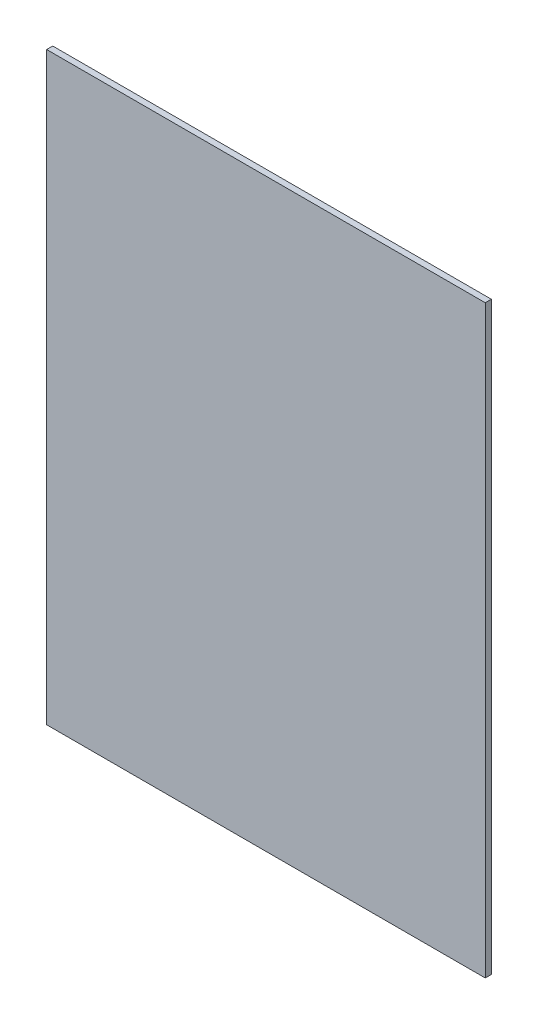
ISO-10303-21;
HEADER;
FILE_DESCRIPTION(('STEP AP214'),'2;1');
FILE_NAME('part.step','',(''),(''),'','','');
FILE_SCHEMA(('AUTOMOTIVE_DESIGN { 1 0 10303 214 1 1 1 1 }'));
ENDSEC;
DATA;
#1=APPLICATION_CONTEXT('core data for automotive mechanical design processes');
#2=APPLICATION_PROTOCOL_DEFINITION('international standard','automotive_design',2000,#1);
#3=PRODUCT_CONTEXT('',#1,'mechanical');
#4=PRODUCT('Part','Part','',(#3));
#5=PRODUCT_RELATED_PRODUCT_CATEGORY('part','',(#4));
#6=PRODUCT_DEFINITION_FORMATION('','',#4);
#7=PRODUCT_DEFINITION_CONTEXT('part definition',#1,'design');
#8=PRODUCT_DEFINITION('design','',#6,#7);
#9=PRODUCT_DEFINITION_SHAPE('','',#8);
#10=(LENGTH_UNIT() NAMED_UNIT(*) SI_UNIT(.MILLI.,.METRE.));
#11=(NAMED_UNIT(*) PLANE_ANGLE_UNIT() SI_UNIT($,.RADIAN.));
#12=(NAMED_UNIT(*) SI_UNIT($,.STERADIAN.) SOLID_ANGLE_UNIT());
#13=UNCERTAINTY_MEASURE_WITH_UNIT(LENGTH_MEASURE(1.E-05),#10,'distance_accuracy_value','');
#14=(GEOMETRIC_REPRESENTATION_CONTEXT(3) GLOBAL_UNCERTAINTY_ASSIGNED_CONTEXT((#13)) GLOBAL_UNIT_ASSIGNED_CONTEXT((#10,
#11,#12)) REPRESENTATION_CONTEXT('',''));
#15=CARTESIAN_POINT('',(0.,0.,0.));
#16=DIRECTION('',(0.,0.,1.));
#17=DIRECTION('',(1.,0.,0.));
#18=AXIS2_PLACEMENT_3D('',#15,#16,#17);
#19=CARTESIAN_POINT('',(-114.3,152.4,3.175));
#20=DIRECTION('',(1.,0.,0.));
#21=DIRECTION('',(0.,1.,0.));
#22=AXIS2_PLACEMENT_3D('',#19,#20,#21);
#23=PLANE('',#22);
#24=DIRECTION('',(0.,-1.,0.));
#25=VECTOR('',#24,1.);
#26=CARTESIAN_POINT('',(-114.3,152.4,0.));
#27=LINE('',#26,#25);
#28=CARTESIAN_POINT('',(-114.3,152.4,0.));
#29=VERTEX_POINT('',#28);
#30=CARTESIAN_POINT('',(-114.3,-152.4,0.));
#31=VERTEX_POINT('',#30);
#32=EDGE_CURVE('E115',#29,#31,#27,.T.);
#33=ORIENTED_EDGE('',*,*,#32,.T.);
#34=DIRECTION('',(0.,0.,-1.));
#35=VECTOR('',#34,1.);
#36=CARTESIAN_POINT('',(-114.3,-152.4,3.175));
#37=LINE('',#36,#35);
#38=CARTESIAN_POINT('',(-114.3,-152.4,3.175));
#39=VERTEX_POINT('',#38);
#40=EDGE_CURVE('E11',#39,#31,#37,.T.);
#41=ORIENTED_EDGE('',*,*,#40,.F.);
#42=DIRECTION('',(0.,-1.,0.));
#43=VECTOR('',#42,1.);
#44=CARTESIAN_POINT('',(-114.3,152.4,3.175));
#45=LINE('',#44,#43);
#46=CARTESIAN_POINT('',(-114.3,152.4,3.175));
#47=VERTEX_POINT('',#46);
#48=EDGE_CURVE('E97',#47,#39,#45,.T.);
#49=ORIENTED_EDGE('',*,*,#48,.F.);
#50=DIRECTION('',(0.,0.,-1.));
#51=VECTOR('',#50,1.);
#52=CARTESIAN_POINT('',(-114.3,152.4,3.175));
#53=LINE('',#52,#51);
#54=EDGE_CURVE('E60',#47,#29,#53,.T.);
#55=ORIENTED_EDGE('',*,*,#54,.T.);
#56=EDGE_LOOP('',(#33,#41,#49,#55));
#57=FACE_BOUND('',#56,.T.);
#58=ADVANCED_FACE('F43',(#57),#23,.F.);
#59=CARTESIAN_POINT('',(-114.3,-152.4,3.175));
#60=DIRECTION('',(0.,1.,0.));
#61=DIRECTION('',(0.,0.,1.));
#62=AXIS2_PLACEMENT_3D('',#59,#60,#61);
#63=PLANE('',#62);
#64=DIRECTION('',(1.,0.,0.));
#65=VECTOR('',#64,1.);
#66=CARTESIAN_POINT('',(-114.3,-152.4,0.));
#67=LINE('',#66,#65);
#68=CARTESIAN_POINT('',(114.3,-152.4,0.));
#69=VERTEX_POINT('',#68);
#70=EDGE_CURVE('E103',#31,#69,#67,.T.);
#71=ORIENTED_EDGE('',*,*,#70,.T.);
#72=DIRECTION('',(0.,0.,-1.));
#73=VECTOR('',#72,1.);
#74=CARTESIAN_POINT('',(114.3,-152.4,3.175));
#75=LINE('',#74,#73);
#76=CARTESIAN_POINT('',(114.3,-152.4,3.175));
#77=VERTEX_POINT('',#76);
#78=EDGE_CURVE('E52',#77,#69,#75,.T.);
#79=ORIENTED_EDGE('',*,*,#78,.F.);
#80=DIRECTION('',(1.,0.,0.));
#81=VECTOR('',#80,1.);
#82=CARTESIAN_POINT('',(-114.3,-152.4,3.175));
#83=LINE('',#82,#81);
#84=EDGE_CURVE('E89',#39,#77,#83,.T.);
#85=ORIENTED_EDGE('',*,*,#84,.F.);
#86=ORIENTED_EDGE('',*,*,#40,.T.);
#87=EDGE_LOOP('',(#71,#79,#85,#86));
#88=FACE_BOUND('',#87,.T.);
#89=ADVANCED_FACE('F102',(#88),#63,.F.);
#90=CARTESIAN_POINT('',(114.3,152.4,3.175));
#91=DIRECTION('',(1.,0.,0.));
#92=DIRECTION('',(0.,1.,0.));
#93=AXIS2_PLACEMENT_3D('',#90,#91,#92);
#94=PLANE('',#93);
#95=DIRECTION('',(0.,-1.,0.));
#96=VECTOR('',#95,1.);
#97=CARTESIAN_POINT('',(114.3,152.4,0.));
#98=LINE('',#97,#96);
#99=CARTESIAN_POINT('',(114.3,152.4,0.));
#100=VERTEX_POINT('',#99);
#101=EDGE_CURVE('E120',#100,#69,#98,.T.);
#102=ORIENTED_EDGE('',*,*,#101,.F.);
#103=DIRECTION('',(0.,0.,-1.));
#104=VECTOR('',#103,1.);
#105=CARTESIAN_POINT('',(114.3,152.4,3.175));
#106=LINE('',#105,#104);
#107=CARTESIAN_POINT('',(114.3,152.4,3.175));
#108=VERTEX_POINT('',#107);
#109=EDGE_CURVE('E76',#108,#100,#106,.T.);
#110=ORIENTED_EDGE('',*,*,#109,.F.);
#111=DIRECTION('',(0.,-1.,0.));
#112=VECTOR('',#111,1.);
#113=CARTESIAN_POINT('',(114.3,152.4,3.175));
#114=LINE('',#113,#112);
#115=EDGE_CURVE('E96',#108,#77,#114,.T.);
#116=ORIENTED_EDGE('',*,*,#115,.T.);
#117=ORIENTED_EDGE('',*,*,#78,.T.);
#118=EDGE_LOOP('',(#102,#110,#116,#117));
#119=FACE_BOUND('',#118,.T.);
#120=ADVANCED_FACE('F107',(#119),#94,.T.);
#121=CARTESIAN_POINT('',(-114.3,152.4,3.175));
#122=DIRECTION('',(0.,1.,0.));
#123=DIRECTION('',(0.,0.,1.));
#124=AXIS2_PLACEMENT_3D('',#121,#122,#123);
#125=PLANE('',#124);
#126=DIRECTION('',(1.,0.,0.));
#127=VECTOR('',#126,1.);
#128=CARTESIAN_POINT('',(-114.3,152.4,0.));
#129=LINE('',#128,#127);
#130=EDGE_CURVE('E123',#29,#100,#129,.T.);
#131=ORIENTED_EDGE('',*,*,#130,.F.);
#132=ORIENTED_EDGE('',*,*,#54,.F.);
#133=DIRECTION('',(1.,0.,0.));
#134=VECTOR('',#133,1.);
#135=CARTESIAN_POINT('',(-114.3,152.4,3.175));
#136=LINE('',#135,#134);
#137=EDGE_CURVE('E109',#47,#108,#136,.T.);
#138=ORIENTED_EDGE('',*,*,#137,.T.);
#139=ORIENTED_EDGE('',*,*,#109,.T.);
#140=EDGE_LOOP('',(#131,#132,#138,#139));
#141=FACE_BOUND('',#140,.T.);
#142=ADVANCED_FACE('F133',(#141),#125,.T.);
#143=CARTESIAN_POINT('',(0.,0.,3.175));
#144=DIRECTION('',(0.,0.,1.));
#145=DIRECTION('',(1.,0.,0.));
#146=AXIS2_PLACEMENT_3D('',#143,#144,#145);
#147=PLANE('',#146);
#148=ORIENTED_EDGE('',*,*,#48,.T.);
#149=ORIENTED_EDGE('',*,*,#84,.T.);
#150=ORIENTED_EDGE('',*,*,#115,.F.);
#151=ORIENTED_EDGE('',*,*,#137,.F.);
#152=EDGE_LOOP('',(#148,#149,#150,#151));
#153=FACE_BOUND('',#152,.T.);
#154=ADVANCED_FACE('F93',(#153),#147,.T.);
#155=CARTESIAN_POINT('',(0.,0.,0.));
#156=DIRECTION('',(0.,0.,1.));
#157=DIRECTION('',(1.,0.,0.));
#158=AXIS2_PLACEMENT_3D('',#155,#156,#157);
#159=PLANE('',#158);
#160=ORIENTED_EDGE('',*,*,#32,.F.);
#161=ORIENTED_EDGE('',*,*,#130,.T.);
#162=ORIENTED_EDGE('',*,*,#101,.T.);
#163=ORIENTED_EDGE('',*,*,#70,.F.);
#164=EDGE_LOOP('',(#160,#161,#162,#163));
#165=FACE_BOUND('',#164,.T.);
#166=ADVANCED_FACE('F132',(#165),#159,.F.);
#167=CLOSED_SHELL('',(#58,#89,#120,#142,#154,#166));
#168=MANIFOLD_SOLID_BREP('B2',#167);
#169=ADVANCED_BREP_SHAPE_REPRESENTATION('',(#18,#168),#14);
#170=SHAPE_DEFINITION_REPRESENTATION(#9,#169);
ENDSEC;
END-ISO-10303-21;
